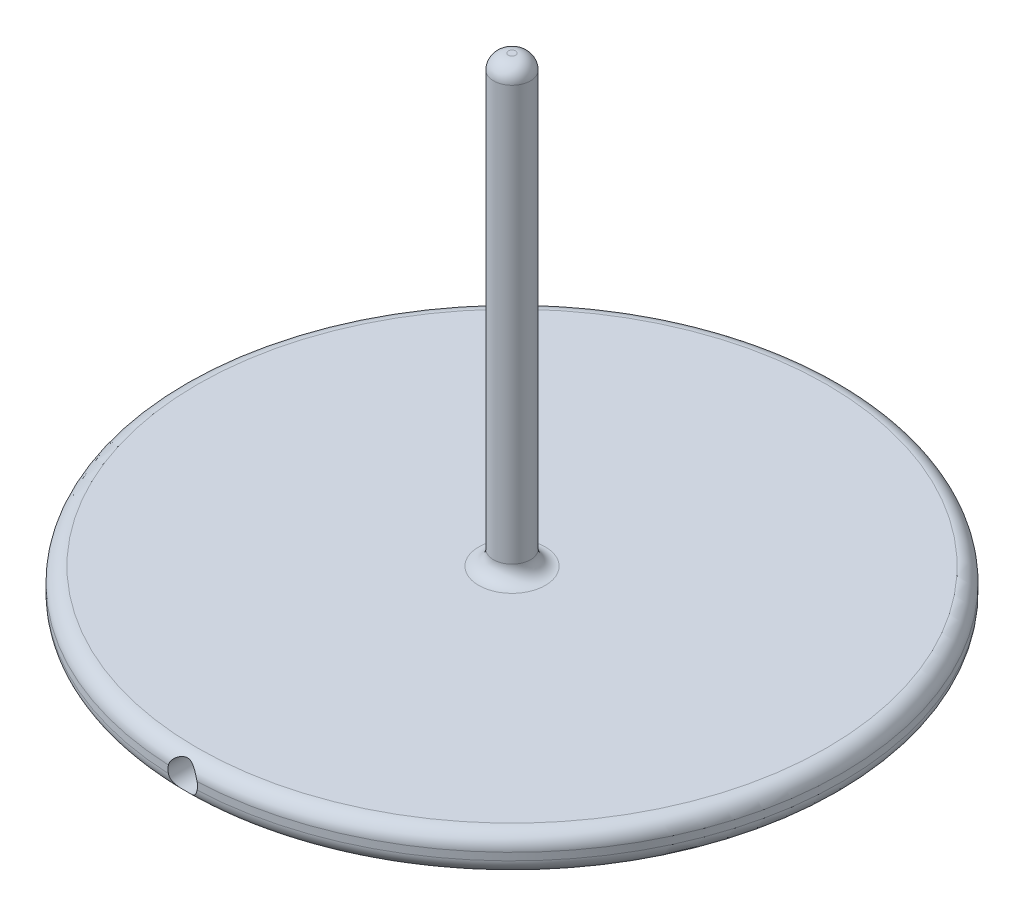
ISO-10303-21;
HEADER;
FILE_DESCRIPTION(('STEP AP214'),'2;1');
FILE_NAME('part.step','',(''),(''),'','','');
FILE_SCHEMA(('AUTOMOTIVE_DESIGN { 1 0 10303 214 1 1 1 1 }'));
ENDSEC;
DATA;
#1=APPLICATION_CONTEXT('core data for automotive mechanical design processes');
#2=APPLICATION_PROTOCOL_DEFINITION('international standard','automotive_design',2000,#1);
#3=PRODUCT_CONTEXT('',#1,'mechanical');
#4=PRODUCT('Part','Part','',(#3));
#5=PRODUCT_RELATED_PRODUCT_CATEGORY('part','',(#4));
#6=PRODUCT_DEFINITION_FORMATION('','',#4);
#7=PRODUCT_DEFINITION_CONTEXT('part definition',#1,'design');
#8=PRODUCT_DEFINITION('design','',#6,#7);
#9=PRODUCT_DEFINITION_SHAPE('','',#8);
#10=(LENGTH_UNIT() NAMED_UNIT(*) SI_UNIT(.MILLI.,.METRE.));
#11=(NAMED_UNIT(*) PLANE_ANGLE_UNIT() SI_UNIT($,.RADIAN.));
#12=(NAMED_UNIT(*) SI_UNIT($,.STERADIAN.) SOLID_ANGLE_UNIT());
#13=UNCERTAINTY_MEASURE_WITH_UNIT(LENGTH_MEASURE(1.E-05),#10,'distance_accuracy_value','');
#14=(GEOMETRIC_REPRESENTATION_CONTEXT(3) GLOBAL_UNCERTAINTY_ASSIGNED_CONTEXT((#13)) GLOBAL_UNIT_ASSIGNED_CONTEXT((#10,
#11,#12)) REPRESENTATION_CONTEXT('',''));
#15=CARTESIAN_POINT('',(0.,0.,0.));
#16=DIRECTION('',(0.,0.,1.));
#17=DIRECTION('',(1.,0.,0.));
#18=AXIS2_PLACEMENT_3D('',#15,#16,#17);
#19=CARTESIAN_POINT('',(0.,6.35,0.));
#20=DIRECTION('',(0.,-1.,0.));
#21=DIRECTION('',(0.,0.,-1.));
#22=AXIS2_PLACEMENT_3D('',#19,#20,#21);
#23=CYLINDRICAL_SURFACE('',#22,56.515);
#24=CARTESIAN_POINT('',(2.54,3.175,56.4578924952039));
#25=CARTESIAN_POINT('',(2.53999370061451,3.03240440928951,56.4578932633823));
#26=CARTESIAN_POINT('',(2.52795170259727,2.88970725734892,56.4584385308526));
#27=CARTESIAN_POINT('',(2.48008386025424,2.60824821254622,56.4605611102301));
#28=CARTESIAN_POINT('',(2.44422987657893,2.46949117838037,56.4621396431468));
#29=CARTESIAN_POINT('',(2.3497655630331,2.20003039594088,56.4661495838549));
#30=CARTESIAN_POINT('',(2.29116669333423,2.06932263035389,56.4685805620763));
#31=CARTESIAN_POINT('',(2.15289326873224,1.81963469365496,56.4740209267653));
#32=CARTESIAN_POINT('',(2.07322373961418,1.70065173521251,56.4770301752571));
#33=CARTESIAN_POINT('',(1.89499485933581,1.47765452795055,56.4832909163558));
#34=CARTESIAN_POINT('',(1.79642165212948,1.373651357564,56.4865425855775));
#35=CARTESIAN_POINT('',(1.58321067044805,1.1836602338987,56.492920085219));
#36=CARTESIAN_POINT('',(1.46857224538641,1.09767301055641,56.4960459105358));
#37=CARTESIAN_POINT('',(1.22642985775852,0.946126382510247,56.5018207226372));
#38=CARTESIAN_POINT('',(1.09892070214483,0.880575267276563,56.5044695157402));
#39=CARTESIAN_POINT('',(0.834693008458411,0.771814913020414,56.5089900279017));
#40=CARTESIAN_POINT('',(0.697974530244206,0.728605528797569,56.5108617520105));
#41=CARTESIAN_POINT('',(0.419307955316282,0.665783524308129,56.5136160387354));
#42=CARTESIAN_POINT('',(0.277363489494541,0.646154828099268,56.5144992752168));
#43=CARTESIAN_POINT('',(-0.00780824997116488,0.631001790438194,56.5151793051144));
#44=CARTESIAN_POINT('',(-0.151035515005874,0.635477287336229,56.5149761058167));
#45=CARTESIAN_POINT('',(-0.43459830378975,0.668392210919863,56.5135067338288));
#46=CARTESIAN_POINT('',(-0.57493584148227,0.696814326456496,56.5122413290156));
#47=CARTESIAN_POINT('',(-0.848845801298363,0.776788865070864,56.5087909872582));
#48=CARTESIAN_POINT('',(-0.982418199076686,0.828341371379785,56.5066060470053));
#49=CARTESIAN_POINT('',(-1.23906201845335,0.953133084651019,56.5015614704776));
#50=CARTESIAN_POINT('',(-1.36212959296508,1.02638019310915,56.4987015884562));
#51=CARTESIAN_POINT('',(-1.59422825503659,1.19247610634474,56.4926292661052));
#52=CARTESIAN_POINT('',(-1.70325926357097,1.28532502147197,56.4894168237909));
#53=CARTESIAN_POINT('',(-1.9042907442731,1.48808680590412,56.4829978755164));
#54=CARTESIAN_POINT('',(-1.99627607024655,1.59801469307173,56.4797913773185));
#55=CARTESIAN_POINT('',(-2.16048840709863,1.83176115801755,56.4737486694648));
#56=CARTESIAN_POINT('',(-2.23271541343498,1.9555797389891,56.4709124598942));
#57=CARTESIAN_POINT('',(-2.35535943800865,2.21360180053441,56.465930373428));
#58=CARTESIAN_POINT('',(-2.40577591014037,2.34780554103903,56.463784513818));
#59=CARTESIAN_POINT('',(-2.48335772378032,2.62278432790172,56.4604257882215));
#60=CARTESIAN_POINT('',(-2.51052320662931,2.76355933430815,56.4592129165634));
#61=CARTESIAN_POINT('',(-2.54081322583211,3.04755267959572,56.457857981673));
#62=CARTESIAN_POINT('',(-2.54395877327342,3.19076877322199,56.4577149825875));
#63=CARTESIAN_POINT('',(-2.5261744392068,3.47569482295532,56.4585134756815));
#64=CARTESIAN_POINT('',(-2.50524462177307,3.61740478306979,56.4594549649746));
#65=CARTESIAN_POINT('',(-2.43992109694011,3.89523704384981,56.4623154605012));
#66=CARTESIAN_POINT('',(-2.39553698613319,4.03136160531448,56.4642340669245));
#67=CARTESIAN_POINT('',(-2.28457449050229,4.29422857644568,56.4688322006321));
#68=CARTESIAN_POINT('',(-2.21799600227759,4.42097094239839,56.4715117314614));
#69=CARTESIAN_POINT('',(-2.06448067221496,4.66157247761793,56.4773319700308));
#70=CARTESIAN_POINT('',(-1.97752970501194,4.77542262638621,56.4804729971857));
#71=CARTESIAN_POINT('',(-1.78575830170564,4.98691724216405,56.4868610573749));
#72=CARTESIAN_POINT('',(-1.68093777200325,5.08456162428403,56.4901080909645));
#73=CARTESIAN_POINT('',(-1.45631254020227,5.26094341121403,56.4963449042976));
#74=CARTESIAN_POINT('',(-1.33649718137761,5.33966725194437,56.499334498504));
#75=CARTESIAN_POINT('',(-1.08533739388247,5.47588056328236,56.5047168328406));
#76=CARTESIAN_POINT('',(-0.953993008172821,5.53337011301162,56.5071095751946));
#77=CARTESIAN_POINT('',(-0.683554213971591,5.62545917261271,56.5110276378625));
#78=CARTESIAN_POINT('',(-0.544462776248454,5.66006739217027,56.5125532882004));
#79=CARTESIAN_POINT('',(-0.262436459852673,5.70543992242727,56.5145665265754));
#80=CARTESIAN_POINT('',(-0.119501597367836,5.71620433353658,56.5150541189839));
#81=CARTESIAN_POINT('',(0.166019359880607,5.71358268102904,56.514936308832));
#82=CARTESIAN_POINT('',(0.308605651083603,5.70021791443313,56.5143318701254));
#83=CARTESIAN_POINT('',(0.589508094935457,5.64976125544466,56.5120999575675));
#84=CARTESIAN_POINT('',(0.727824239395029,5.61266931755111,56.5104724817543));
#85=CARTESIAN_POINT('',(0.996265181918676,5.5158153446951,56.50637765869));
#86=CARTESIAN_POINT('',(1.12638989029188,5.45605306155749,56.5039103022447));
#87=CARTESIAN_POINT('',(1.37475916593358,5.31555901986397,56.4984133615103));
#88=CARTESIAN_POINT('',(1.49300411713607,5.23482793928722,56.4953837953999));
#89=CARTESIAN_POINT('',(1.71436258813912,5.05461349721827,56.4891005325912));
#90=CARTESIAN_POINT('',(1.81746432202623,4.95511566575267,56.4858466641827));
#91=CARTESIAN_POINT('',(2.00553184079749,4.74019453491209,56.4794825317884));
#92=CARTESIAN_POINT('',(2.09049314887223,4.62476731592596,56.476372303399));
#93=CARTESIAN_POINT('',(2.23990023885602,4.38118696422676,56.4706444484581));
#94=CARTESIAN_POINT('',(2.30432820268729,4.25302290476398,56.468027250541));
#95=CARTESIAN_POINT('',(2.4106752204118,3.98778189774758,56.4635876445954));
#96=CARTESIAN_POINT('',(2.45262093773713,3.850715725269,56.4617642955643));
#97=CARTESIAN_POINT('',(2.5017761463059,3.62316134913464,56.4596021692194));
#98=CARTESIAN_POINT('',(2.51609187074847,3.5341480268619,56.4589638562999));
#99=CARTESIAN_POINT('',(2.53520578387904,3.35510331004385,56.4581087768224));
#100=CARTESIAN_POINT('',(2.54000397906919,3.26507191619412,56.4578920099764));
#101=CARTESIAN_POINT('',(2.54,3.175,56.4578924952039));
#102=B_SPLINE_CURVE_WITH_KNOTS('',3,(#24,#25,#26,#27,#28,#29,#30,#31,#32,#33,#34,#35,#36,#37,
#38,#39,#40,#41,#42,#43,#44,#45,#46,#47,#48,#49,#50,#51,#52,#53,#54,#55,#56,#57,#58,#59,#60,#61,
#62,#63,#64,#65,#66,#67,#68,#69,#70,#71,#72,#73,#74,#75,#76,#77,#78,#79,#80,#81,#82,#83,#84,#85,
#86,#87,#88,#89,#90,#91,#92,#93,#94,#95,#96,#97,#98,#99,#100,#101),.UNSPECIFIED.,.T.,.F.,(4,2,2,
2,2,2,2,2,2,2,2,2,2,2,2,2,2,2,2,2,2,2,2,2,2,2,2,2,2,2,2,2,2,2,2,2,2,2,4),(0.,0.427457981942744,
0.855422004977887,1.28317067464539,1.71081740933947,2.13877880759825,2.56675754184523,
2.994909651318,3.42305897816709,3.85091625175137,4.2787706560035,4.70631602695369,
5.13386293637307,5.56156575660559,5.9892709846857,6.41735445311565,6.84543801995852,
7.27353230480117,7.7016239872771,8.12934115986617,8.55705719413116,8.98459835883935,
9.41214151543445,9.83998199317995,10.2678247119828,10.6959732411246,11.1241201749155,
11.5521040423364,11.9800861074493,12.4076906094478,12.8352959314551,13.2629059346472,
13.6905021137471,14.1184293457645,14.5464620626275,14.9748652054762,15.4027591413814,
15.6727673908499,15.9427754558554),.UNSPECIFIED.);
#103=CARTESIAN_POINT('',(2.45934442484171,3.81,56.4614634064687));
#104=VERTEX_POINT('',#103);
#105=CARTESIAN_POINT('',(2.45934442484171,2.54,56.4614634064687));
#106=VERTEX_POINT('',#105);
#107=EDGE_CURVE('E73',#104,#106,#102,.T.);
#108=ORIENTED_EDGE('',*,*,#107,.T.);
#109=CARTESIAN_POINT('',(0.,2.54,0.));
#110=DIRECTION('',(0.,1.,0.));
#111=DIRECTION('',(0.,0.,1.));
#112=AXIS2_PLACEMENT_3D('',#109,#110,#111);
#113=CIRCLE('',#112,56.515);
#114=CARTESIAN_POINT('',(-2.45934442484171,2.54,56.4614634064687));
#115=VERTEX_POINT('',#114);
#116=EDGE_CURVE('E85',#106,#115,#113,.T.);
#117=ORIENTED_EDGE('',*,*,#116,.T.);
#118=CARTESIAN_POINT('',(-2.45934442484171,3.81,56.4614634064687));
#119=VERTEX_POINT('',#118);
#120=EDGE_CURVE('E76',#115,#119,#102,.T.);
#121=ORIENTED_EDGE('',*,*,#120,.T.);
#122=CARTESIAN_POINT('',(0.,3.81,0.));
#123=DIRECTION('',(0.,1.,0.));
#124=DIRECTION('',(0.,0.,1.));
#125=AXIS2_PLACEMENT_3D('',#122,#123,#124);
#126=CIRCLE('',#125,56.515);
#127=EDGE_CURVE('E82',#119,#104,#126,.F.);
#128=ORIENTED_EDGE('',*,*,#127,.T.);
#129=EDGE_LOOP('',(#108,#117,#121,#128));
#130=FACE_BOUND('',#129,.T.);
#131=ADVANCED_FACE('F44',(#130),#23,.T.);
#132=CARTESIAN_POINT('',(0.,6.35,0.));
#133=DIRECTION('',(0.,1.,0.));
#134=DIRECTION('',(0.,0.,1.));
#135=AXIS2_PLACEMENT_3D('',#132,#133,#134);
#136=PLANE('',#135);
#137=CARTESIAN_POINT('',(0.,6.35,0.));
#138=DIRECTION('',(0.,1.,0.));
#139=DIRECTION('',(0.,0.,1.));
#140=AXIS2_PLACEMENT_3D('',#137,#138,#139);
#141=CIRCLE('',#140,5.715);
#142=CARTESIAN_POINT('',(0.,6.35,5.715));
#143=VERTEX_POINT('',#142);
#144=EDGE_CURVE('E91',#143,#143,#141,.F.);
#145=ORIENTED_EDGE('',*,*,#144,.T.);
#146=EDGE_LOOP('',(#145));
#147=FACE_BOUND('',#146,.T.);
#148=CARTESIAN_POINT('',(0.,6.35,0.));
#149=DIRECTION('',(0.,1.,0.));
#150=DIRECTION('',(0.,0.,1.));
#151=AXIS2_PLACEMENT_3D('',#148,#149,#150);
#152=CIRCLE('',#151,53.975);
#153=CARTESIAN_POINT('',(0.,6.35,53.975));
#154=VERTEX_POINT('',#153);
#155=EDGE_CURVE('E159',#154,#154,#152,.T.);
#156=ORIENTED_EDGE('',*,*,#155,.T.);
#157=EDGE_LOOP('',(#156));
#158=FACE_BOUND('',#157,.T.);
#159=ADVANCED_FACE('F130',(#147,#158),#136,.T.);
#160=CARTESIAN_POINT('',(0.,0.,0.));
#161=DIRECTION('',(0.,1.,0.));
#162=DIRECTION('',(0.,0.,1.));
#163=AXIS2_PLACEMENT_3D('',#160,#161,#162);
#164=PLANE('',#163);
#165=CARTESIAN_POINT('',(0.,0.,0.));
#166=DIRECTION('',(0.,1.,0.));
#167=DIRECTION('',(0.,0.,1.));
#168=AXIS2_PLACEMENT_3D('',#165,#166,#167);
#169=CIRCLE('',#168,53.975);
#170=CARTESIAN_POINT('',(0.,0.,53.975));
#171=VERTEX_POINT('',#170);
#172=EDGE_CURVE('E11',#171,#171,#169,.F.);
#173=ORIENTED_EDGE('',*,*,#172,.T.);
#174=EDGE_LOOP('',(#173));
#175=FACE_BOUND('',#174,.T.);
#176=ADVANCED_FACE('F126',(#175),#164,.F.);
#177=CARTESIAN_POINT('',(0.,82.55,0.));
#178=DIRECTION('',(0.,-1.,0.));
#179=DIRECTION('',(0.,0.,-1.));
#180=AXIS2_PLACEMENT_3D('',#177,#178,#179);
#181=CYLINDRICAL_SURFACE('',#180,3.175);
#182=CARTESIAN_POINT('',(0.,80.01,0.));
#183=DIRECTION('',(0.,1.,0.));
#184=DIRECTION('',(0.,0.,1.));
#185=AXIS2_PLACEMENT_3D('',#182,#183,#184);
#186=CIRCLE('',#185,3.175);
#187=CARTESIAN_POINT('',(0.,80.01,-3.175));
#188=VERTEX_POINT('',#187);
#189=EDGE_CURVE('E162',#188,#188,#186,.F.);
#190=CARTESIAN_POINT('',(0.,8.89000000000001,0.));
#191=DIRECTION('',(0.,1.,0.));
#192=DIRECTION('',(0.,0.,1.));
#193=AXIS2_PLACEMENT_3D('',#190,#191,#192);
#194=CIRCLE('',#193,3.175);
#195=CARTESIAN_POINT('',(0.,8.89000000000001,-3.175));
#196=VERTEX_POINT('',#195);
#197=EDGE_CURVE('E169',#196,#196,#194,.T.);
#198=CARTESIAN_POINT('',(0.,80.01,-3.175));
#199=CARTESIAN_POINT('',(0.,79.2691666666666,-3.175));
#200=CARTESIAN_POINT('',(0.,78.5283333333333,-3.175));
#201=CARTESIAN_POINT('',(0.,77.0466666666667,-3.175));
#202=CARTESIAN_POINT('',(0.,76.3058333333333,-3.175));
#203=CARTESIAN_POINT('',(0.,74.8241666666667,-3.175));
#204=CARTESIAN_POINT('',(0.,74.0833333333333,-3.175));
#205=CARTESIAN_POINT('',(0.,72.6016666666667,-3.175));
#206=CARTESIAN_POINT('',(0.,71.8608333333333,-3.175));
#207=CARTESIAN_POINT('',(0.,70.3791666666667,-3.175));
#208=CARTESIAN_POINT('',(0.,69.6383333333333,-3.175));
#209=CARTESIAN_POINT('',(0.,68.1566666666667,-3.175));
#210=CARTESIAN_POINT('',(0.,67.4158333333333,-3.175));
#211=CARTESIAN_POINT('',(0.,65.9341666666667,-3.175));
#212=CARTESIAN_POINT('',(0.,65.1933333333333,-3.175));
#213=CARTESIAN_POINT('',(0.,63.7116666666667,-3.175));
#214=CARTESIAN_POINT('',(0.,62.9708333333333,-3.175));
#215=CARTESIAN_POINT('',(0.,61.4891666666667,-3.175));
#216=CARTESIAN_POINT('',(0.,60.7483333333333,-3.175));
#217=CARTESIAN_POINT('',(0.,59.2666666666667,-3.175));
#218=CARTESIAN_POINT('',(0.,58.5258333333333,-3.175));
#219=CARTESIAN_POINT('',(0.,57.0441666666667,-3.175));
#220=CARTESIAN_POINT('',(0.,56.3033333333333,-3.175));
#221=CARTESIAN_POINT('',(0.,54.8216666666667,-3.175));
#222=CARTESIAN_POINT('',(0.,54.0808333333333,-3.175));
#223=CARTESIAN_POINT('',(0.,52.5991666666667,-3.175));
#224=CARTESIAN_POINT('',(0.,51.8583333333333,-3.175));
#225=CARTESIAN_POINT('',(0.,50.3766666666667,-3.175));
#226=CARTESIAN_POINT('',(0.,49.6358333333333,-3.175));
#227=CARTESIAN_POINT('',(0.,48.1541666666667,-3.175));
#228=CARTESIAN_POINT('',(0.,47.4133333333333,-3.175));
#229=CARTESIAN_POINT('',(0.,45.9316666666667,-3.175));
#230=CARTESIAN_POINT('',(0.,45.1908333333333,-3.175));
#231=CARTESIAN_POINT('',(0.,43.7091666666667,-3.175));
#232=CARTESIAN_POINT('',(0.,42.9683333333333,-3.175));
#233=CARTESIAN_POINT('',(0.,41.4866666666667,-3.175));
#234=CARTESIAN_POINT('',(0.,40.7458333333333,-3.175));
#235=CARTESIAN_POINT('',(0.,39.2641666666667,-3.175));
#236=CARTESIAN_POINT('',(0.,38.5233333333333,-3.175));
#237=CARTESIAN_POINT('',(0.,37.0416666666667,-3.175));
#238=CARTESIAN_POINT('',(0.,36.3008333333333,-3.175));
#239=CARTESIAN_POINT('',(0.,34.8191666666667,-3.175));
#240=CARTESIAN_POINT('',(0.,34.0783333333333,-3.175));
#241=CARTESIAN_POINT('',(0.,32.5966666666667,-3.175));
#242=CARTESIAN_POINT('',(0.,31.8558333333333,-3.175));
#243=CARTESIAN_POINT('',(0.,30.3741666666667,-3.175));
#244=CARTESIAN_POINT('',(0.,29.6333333333333,-3.175));
#245=CARTESIAN_POINT('',(0.,28.1516666666667,-3.175));
#246=CARTESIAN_POINT('',(0.,27.4108333333333,-3.175));
#247=CARTESIAN_POINT('',(0.,25.9291666666667,-3.175));
#248=CARTESIAN_POINT('',(0.,25.1883333333333,-3.175));
#249=CARTESIAN_POINT('',(0.,23.7066666666667,-3.175));
#250=CARTESIAN_POINT('',(0.,22.9658333333333,-3.175));
#251=CARTESIAN_POINT('',(0.,21.4841666666667,-3.175));
#252=CARTESIAN_POINT('',(0.,20.7433333333333,-3.175));
#253=CARTESIAN_POINT('',(0.,19.2616666666667,-3.175));
#254=CARTESIAN_POINT('',(0.,18.5208333333333,-3.175));
#255=CARTESIAN_POINT('',(0.,17.0391666666667,-3.175));
#256=CARTESIAN_POINT('',(0.,16.2983333333333,-3.175));
#257=CARTESIAN_POINT('',(0.,14.8166666666667,-3.175));
#258=CARTESIAN_POINT('',(0.,14.0758333333333,-3.175));
#259=CARTESIAN_POINT('',(0.,12.5941666666667,-3.175));
#260=CARTESIAN_POINT('',(0.,11.8533333333333,-3.175));
#261=CARTESIAN_POINT('',(0.,10.3716666666667,-3.175));
#262=CARTESIAN_POINT('',(0.,9.63083333333334,-3.175));
#263=CARTESIAN_POINT('',(0.,8.89000000000001,-3.175));
#264=B_SPLINE_CURVE_WITH_KNOTS('',3,(#198,#199,#200,#201,#202,#203,#204,#205,#206,#207,#208,
#209,#210,#211,#212,#213,#214,#215,#216,#217,#218,#219,#220,#221,#222,#223,#224,#225,#226,#227,
#228,#229,#230,#231,#232,#233,#234,#235,#236,#237,#238,#239,#240,#241,#242,#243,#244,#245,#246,
#247,#248,#249,#250,#251,#252,#253,#254,#255,#256,#257,#258,#259,#260,#261,#262,#263),
.UNSPECIFIED.,.F.,.F.,(4,2,2,2,2,2,2,2,2,2,2,2,2,2,2,2,2,2,2,2,2,2,2,2,2,2,2,2,2,2,2,2,4),(0.,
2.22249999999999,4.44499999999999,6.66749999999999,8.89,11.1125,13.335,15.5575,17.78,20.0025,
22.225,24.4475,26.67,28.8925,31.115,33.3375,35.56,37.7825,40.005,42.2275,44.45,46.6725,48.895,
51.1175,53.34,55.5625,57.785,60.0075,62.23,64.4525,66.675,68.8975,71.12),.UNSPECIFIED.);
#265=EDGE_CURVE('BSEAM148',#188,#196,#264,.T.);
#266=ORIENTED_EDGE('',*,*,#189,.T.);
#267=ORIENTED_EDGE('',*,*,#197,.T.);
#268=ORIENTED_EDGE('',*,*,#265,.T.);
#269=ORIENTED_EDGE('',*,*,#265,.F.);
#270=EDGE_LOOP('',(#266,#268,#267,#269));
#271=FACE_BOUND('',#270,.T.);
#272=ADVANCED_FACE('F148',(#271),#181,.T.);
#273=CARTESIAN_POINT('',(0.,82.55,0.));
#274=DIRECTION('',(0.,1.,0.));
#275=DIRECTION('',(0.,0.,1.));
#276=AXIS2_PLACEMENT_3D('',#273,#274,#275);
#277=PLANE('',#276);
#278=CARTESIAN_POINT('',(0.,82.55,0.));
#279=DIRECTION('',(0.,1.,0.));
#280=DIRECTION('',(0.,0.,1.));
#281=AXIS2_PLACEMENT_3D('',#278,#279,#280);
#282=CIRCLE('',#281,0.635);
#283=CARTESIAN_POINT('',(0.,82.55,0.635));
#284=VERTEX_POINT('',#283);
#285=EDGE_CURVE('E121',#284,#284,#282,.T.);
#286=ORIENTED_EDGE('',*,*,#285,.T.);
#287=EDGE_LOOP('',(#286));
#288=FACE_BOUND('',#287,.T.);
#289=ADVANCED_FACE('F109',(#288),#277,.T.);
#290=CARTESIAN_POINT('',(0.,3.175,31.115));
#291=DIRECTION('',(0.,0.,1.));
#292=DIRECTION('',(1.,0.,0.));
#293=AXIS2_PLACEMENT_3D('',#290,#291,#292);
#294=CYLINDRICAL_SURFACE('',#293,2.54);
#295=CARTESIAN_POINT('',(0.,3.175,31.115));
#296=DIRECTION('',(0.,0.,1.));
#297=DIRECTION('',(1.,0.,0.));
#298=AXIS2_PLACEMENT_3D('',#295,#296,#297);
#299=CIRCLE('',#298,2.54);
#300=CARTESIAN_POINT('',(2.54,3.175,31.115));
#301=VERTEX_POINT('',#300);
#302=EDGE_CURVE('E84',#301,#301,#299,.T.);
#303=ORIENTED_EDGE('',*,*,#302,.F.);
#304=EDGE_LOOP('',(#303));
#305=FACE_BOUND('',#304,.T.);
#306=ORIENTED_EDGE('',*,*,#120,.F.);
#307=CARTESIAN_POINT('',(-2.45934442484171,2.54,56.4614634064687));
#308=CARTESIAN_POINT('',(-2.44377469761417,2.47963859216742,56.4621548656257));
#309=CARTESIAN_POINT('',(-2.42595532266914,2.4198613677153,56.4607583560782));
#310=CARTESIAN_POINT('',(-2.38607807087248,2.30203093548825,56.4541143436791));
#311=CARTESIAN_POINT('',(-2.36402513710369,2.24397580738536,56.448871312059));
#312=CARTESIAN_POINT('',(-2.31611245660021,2.13049583397642,56.4349199179635));
#313=CARTESIAN_POINT('',(-2.29028729239818,2.07505257917791,56.4262419259064));
#314=CARTESIAN_POINT('',(-2.23497694755929,1.96661825008071,56.4058019790071));
#315=CARTESIAN_POINT('',(-2.2054908279685,1.91362780967848,56.3940392321296));
#316=CARTESIAN_POINT('',(-2.1122598919065,1.75925222720971,56.3548369742265));
#317=CARTESIAN_POINT('',(-2.04348220613691,1.6618545166235,56.3234010532069));
#318=CARTESIAN_POINT('',(-1.89453804580201,1.47903396003293,56.2530854596685));
#319=CARTESIAN_POINT('',(-1.81434424324516,1.39364085492218,56.2141878453083));
#320=CARTESIAN_POINT('',(-1.63290204995711,1.22498778896688,56.1268284603796));
#321=CARTESIAN_POINT('',(-1.53027192104035,1.14351964353619,56.0777826413269));
#322=CARTESIAN_POINT('',(-1.31378835014618,0.997238003198542,55.9794700003681));
#323=CARTESIAN_POINT('',(-1.19993028935027,0.932431402203166,55.9302030955358));
#324=CARTESIAN_POINT('',(-0.97693872246404,0.827587069311244,55.8436265162048));
#325=CARTESIAN_POINT('',(-0.869088336848916,0.785433294201345,55.8055941449624));
#326=CARTESIAN_POINT('',(-0.645935926606075,0.715741921144273,55.7394488674154));
#327=CARTESIAN_POINT('',(-0.530652868130581,0.68816865417455,55.7113118107787));
#328=CARTESIAN_POINT('',(-0.315706513930537,0.652785660077053,55.674363654683));
#329=CARTESIAN_POINT('',(-0.21693809188122,0.642322881949145,55.6629958217594));
#330=CARTESIAN_POINT('',(-0.0182530408478226,0.633124411622233,55.6530264578158));
#331=CARTESIAN_POINT('',(0.0816624144373418,0.634377642805635,55.6544128685849));
#332=CARTESIAN_POINT('',(0.279361897681338,0.648467196333746,55.6696147139825));
#333=CARTESIAN_POINT('',(0.377151095351925,0.661271186344403,55.6833954546677));
#334=CARTESIAN_POINT('',(0.568834832444145,0.697585583341142,55.7208382042845));
#335=CARTESIAN_POINT('',(0.662721219695752,0.721117281567745,55.7445198557279));
#336=CARTESIAN_POINT('',(0.891117828340568,0.792118756014795,55.8119837849941));
#337=CARTESIAN_POINT('',(1.02249936320794,0.845674401977821,55.8598980410332));
#338=CARTESIAN_POINT('',(1.27314121816545,0.972611293715875,55.9611030137813));
#339=CARTESIAN_POINT('',(1.39237464660024,1.04603526247173,56.014405159551));
#340=CARTESIAN_POINT('',(1.62080018107287,1.21407594465365,56.1205933091385));
#341=CARTESIAN_POINT('',(1.72964127337713,1.30920395803901,56.1734306184514));
#342=CARTESIAN_POINT('',(1.93124793588875,1.51882350844773,56.2705627762475));
#343=CARTESIAN_POINT('',(2.02404337950624,1.6332782603603,56.3148735170443));
#344=CARTESIAN_POINT('',(2.17013124529839,1.85026818336957,56.3798334003827));
#345=CARTESIAN_POINT('',(2.22756112374027,1.9490864721484,56.4036081867756));
#346=CARTESIAN_POINT('',(2.32908314053967,2.15516342854797,56.4398400447258));
#347=CARTESIAN_POINT('',(2.37321315891517,2.26239700725292,56.452329465686));
#348=CARTESIAN_POINT('',(2.41904166181721,2.39995436087379,56.4594910544671));
#349=CARTESIAN_POINT('',(2.42777562585714,2.42776521262026,56.4605021884226));
#350=CARTESIAN_POINT('',(2.44428168276474,2.48367384464022,56.4616462449257));
#351=CARTESIAN_POINT('',(2.4520542456984,2.51177147736246,56.4617795983327));
#352=CARTESIAN_POINT('',(2.45934442484171,2.54,56.4614634064687));
#353=B_SPLINE_CURVE_WITH_KNOTS('',3,(#307,#308,#309,#310,#311,#312,#313,#314,#315,#316,#317,
#318,#319,#320,#321,#322,#323,#324,#325,#326,#327,#328,#329,#330,#331,#332,#333,#334,#335,#336,
#337,#338,#339,#340,#341,#342,#343,#344,#345,#346,#347,#348,#349,#350,#351,#352),.UNSPECIFIED.,
.F.,.F.,(4,2,2,2,2,2,2,2,2,2,2,2,2,2,2,2,2,2,2,2,2,2,4),(0.,0.18690598152656,0.373595045431999,
0.558669090927215,0.743790702249872,1.1120590195408,1.48122420641993,1.89945252461349,
2.31785361224441,2.68231702408652,3.04588465714703,3.34441584692149,3.64266482616803,
3.94008154268292,4.23809112821278,4.68493191796862,5.13274129444628,5.59245009208469,
6.05129357736802,6.40017489518199,6.74805294561583,6.83553571553801,6.92297554125396),.UNSPECIFIED.);
#354=EDGE_CURVE('E54',#115,#106,#353,.T.);
#355=ORIENTED_EDGE('',*,*,#354,.T.);
#356=ORIENTED_EDGE('',*,*,#107,.F.);
#357=CARTESIAN_POINT('',(2.45934442484171,3.81,56.4614634064687));
#358=CARTESIAN_POINT('',(2.44377469761417,3.87036140783257,56.4621548656257));
#359=CARTESIAN_POINT('',(2.42595532266914,3.9301386322847,56.4607583560782));
#360=CARTESIAN_POINT('',(2.38607807087248,4.04796906451175,56.4541143436791));
#361=CARTESIAN_POINT('',(2.36402513710369,4.10602419261464,56.448871312059));
#362=CARTESIAN_POINT('',(2.31611245660021,4.21950416602358,56.4349199179635));
#363=CARTESIAN_POINT('',(2.29028729239818,4.27494742082209,56.4262419259064));
#364=CARTESIAN_POINT('',(2.23497694755929,4.38338174991929,56.4058019790071));
#365=CARTESIAN_POINT('',(2.2054908279685,4.43637219032152,56.3940392321296));
#366=CARTESIAN_POINT('',(2.1122598919065,4.59074777279029,56.3548369742265));
#367=CARTESIAN_POINT('',(2.04348220613691,4.6881454833765,56.3234010532069));
#368=CARTESIAN_POINT('',(1.89453804580201,4.87096603996707,56.2530854596685));
#369=CARTESIAN_POINT('',(1.81434424324516,4.95635914507782,56.2141878453083));
#370=CARTESIAN_POINT('',(1.63290204995711,5.12501221103312,56.1268284603796));
#371=CARTESIAN_POINT('',(1.53027192104035,5.20648035646381,56.0777826413269));
#372=CARTESIAN_POINT('',(1.31378835014618,5.35276199680146,55.9794700003681));
#373=CARTESIAN_POINT('',(1.19993028935027,5.41756859779683,55.9302030955358));
#374=CARTESIAN_POINT('',(0.976938722464041,5.52241293068876,55.8436265162048));
#375=CARTESIAN_POINT('',(0.869088336848917,5.56456670579865,55.8055941449624));
#376=CARTESIAN_POINT('',(0.645935926606076,5.63425807885573,55.7394488674154));
#377=CARTESIAN_POINT('',(0.530652868130583,5.66183134582545,55.7113118107787));
#378=CARTESIAN_POINT('',(0.315706513930539,5.69721433992295,55.674363654683));
#379=CARTESIAN_POINT('',(0.216938091881222,5.70767711805085,55.6629958217594));
#380=CARTESIAN_POINT('',(0.0182530408478244,5.71687558837777,55.6530264578158));
#381=CARTESIAN_POINT('',(-0.0816624144373401,5.71562235719436,55.6544128685849));
#382=CARTESIAN_POINT('',(-0.279361897681335,5.70153280366625,55.6696147139825));
#383=CARTESIAN_POINT('',(-0.377151095351922,5.6887288136556,55.6833954546677));
#384=CARTESIAN_POINT('',(-0.568834832444142,5.65241441665886,55.7208382042845));
#385=CARTESIAN_POINT('',(-0.662721219695751,5.62888271843226,55.7445198557279));
#386=CARTESIAN_POINT('',(-0.891117828340568,5.55788124398521,55.8119837849941));
#387=CARTESIAN_POINT('',(-1.02249936320794,5.50432559802218,55.8598980410332));
#388=CARTESIAN_POINT('',(-1.27314121816545,5.37738870628413,55.9611030137813));
#389=CARTESIAN_POINT('',(-1.39237464660024,5.30396473752827,56.014405159551));
#390=CARTESIAN_POINT('',(-1.62080018107286,5.13592405534635,56.1205933091385));
#391=CARTESIAN_POINT('',(-1.72964127337713,5.04079604196099,56.1734306184514));
#392=CARTESIAN_POINT('',(-1.93124793588874,4.83117649155228,56.2705627762475));
#393=CARTESIAN_POINT('',(-2.02404337950624,4.71672173963971,56.3148735170443));
#394=CARTESIAN_POINT('',(-2.17013124529839,4.49973181663043,56.3798334003827));
#395=CARTESIAN_POINT('',(-2.22756112374027,4.40091352785161,56.4036081867756));
#396=CARTESIAN_POINT('',(-2.32908314053966,4.19483657145204,56.4398400447258));
#397=CARTESIAN_POINT('',(-2.37321315891517,4.08760299274709,56.452329465686));
#398=CARTESIAN_POINT('',(-2.4190416618172,3.95004563912621,56.4594910544671));
#399=CARTESIAN_POINT('',(-2.42777562585714,3.92223478737974,56.4605021884226));
#400=CARTESIAN_POINT('',(-2.44428168276474,3.86632615535978,56.4616462449257));
#401=CARTESIAN_POINT('',(-2.4520542456984,3.83822852263754,56.4617795983327));
#402=CARTESIAN_POINT('',(-2.45934442484171,3.81,56.4614634064687));
#403=B_SPLINE_CURVE_WITH_KNOTS('',3,(#357,#358,#359,#360,#361,#362,#363,#364,#365,#366,#367,
#368,#369,#370,#371,#372,#373,#374,#375,#376,#377,#378,#379,#380,#381,#382,#383,#384,#385,#386,
#387,#388,#389,#390,#391,#392,#393,#394,#395,#396,#397,#398,#399,#400,#401,#402),.UNSPECIFIED.,
.F.,.F.,(4,2,2,2,2,2,2,2,2,2,2,2,2,2,2,2,2,2,2,2,2,2,4),(0.,0.18690598152656,0.373595045431999,
0.558669090927215,0.743790702249872,1.1120590195408,1.48122420641993,1.89945252461349,
2.31785361224441,2.68231702408652,3.04588465714703,3.34441584692149,3.64266482616802,
3.94008154268291,4.23809112821277,4.68493191796862,5.13274129444628,5.59245009208469,
6.05129357736802,6.40017489518199,6.74805294561582,6.83553571553801,6.92297554125397),.UNSPECIFIED.);
#404=EDGE_CURVE('E61',#104,#119,#403,.T.);
#405=ORIENTED_EDGE('',*,*,#404,.T.);
#406=EDGE_LOOP('',(#306,#355,#356,#405));
#407=FACE_BOUND('',#406,.T.);
#408=ADVANCED_FACE('F74',(#305,#407),#294,.F.);
#409=CARTESIAN_POINT('',(0.,3.175,31.115));
#410=DIRECTION('',(0.,0.,1.));
#411=DIRECTION('',(1.,0.,0.));
#412=AXIS2_PLACEMENT_3D('',#409,#410,#411);
#413=PLANE('',#412);
#414=ORIENTED_EDGE('',*,*,#302,.T.);
#415=EDGE_LOOP('',(#414));
#416=FACE_BOUND('',#415,.T.);
#417=ADVANCED_FACE('F108',(#416),#413,.T.);
#418=CARTESIAN_POINT('',(0.,80.01,0.));
#419=DIRECTION('',(0.,1.,0.));
#420=DIRECTION('',(0.,0.,1.));
#421=AXIS2_PLACEMENT_3D('',#418,#419,#420);
#422=DEGENERATE_TOROIDAL_SURFACE('',#421,0.635,2.54,.T.);
#423=ORIENTED_EDGE('',*,*,#189,.F.);
#424=EDGE_LOOP('',(#423));
#425=FACE_BOUND('',#424,.T.);
#426=ORIENTED_EDGE('',*,*,#285,.F.);
#427=EDGE_LOOP('',(#426));
#428=FACE_BOUND('',#427,.T.);
#429=ADVANCED_FACE('F128',(#425,#428),#422,.T.);
#430=CARTESIAN_POINT('',(0.,8.89,0.));
#431=DIRECTION('',(0.,1.,0.));
#432=DIRECTION('',(0.,0.,1.));
#433=AXIS2_PLACEMENT_3D('',#430,#431,#432);
#434=TOROIDAL_SURFACE('',#433,5.715,2.54);
#435=ORIENTED_EDGE('',*,*,#144,.F.);
#436=EDGE_LOOP('',(#435));
#437=FACE_BOUND('',#436,.T.);
#438=ORIENTED_EDGE('',*,*,#197,.F.);
#439=EDGE_LOOP('',(#438));
#440=FACE_BOUND('',#439,.T.);
#441=ADVANCED_FACE('F132',(#437,#440),#434,.F.);
#442=CARTESIAN_POINT('',(0.,2.54,0.));
#443=DIRECTION('',(0.,1.,0.));
#444=DIRECTION('',(0.,0.,1.));
#445=AXIS2_PLACEMENT_3D('',#442,#443,#444);
#446=TOROIDAL_SURFACE('',#445,53.975,2.54);
#447=ORIENTED_EDGE('',*,*,#172,.F.);
#448=EDGE_LOOP('',(#447));
#449=FACE_BOUND('',#448,.T.);
#450=ORIENTED_EDGE('',*,*,#354,.F.);
#451=ORIENTED_EDGE('',*,*,#116,.F.);
#452=EDGE_LOOP('',(#450,#451));
#453=FACE_BOUND('',#452,.T.);
#454=ADVANCED_FACE('F87',(#449,#453),#446,.T.);
#455=CARTESIAN_POINT('',(0.,3.81,0.));
#456=DIRECTION('',(0.,1.,0.));
#457=DIRECTION('',(0.,0.,1.));
#458=AXIS2_PLACEMENT_3D('',#455,#456,#457);
#459=TOROIDAL_SURFACE('',#458,53.975,2.54);
#460=ORIENTED_EDGE('',*,*,#404,.F.);
#461=ORIENTED_EDGE('',*,*,#127,.F.);
#462=EDGE_LOOP('',(#460,#461));
#463=FACE_BOUND('',#462,.T.);
#464=ORIENTED_EDGE('',*,*,#155,.F.);
#465=EDGE_LOOP('',(#464));
#466=FACE_BOUND('',#465,.T.);
#467=ADVANCED_FACE('F50',(#463,#466),#459,.T.);
#468=CLOSED_SHELL('',(#131,#159,#176,#272,#289,#408,#417,#429,#441,#454,#467));
#469=MANIFOLD_SOLID_BREP('B2',#468);
#470=ADVANCED_BREP_SHAPE_REPRESENTATION('',(#18,#469),#14);
#471=SHAPE_DEFINITION_REPRESENTATION(#9,#470);
ENDSEC;
END-ISO-10303-21;
